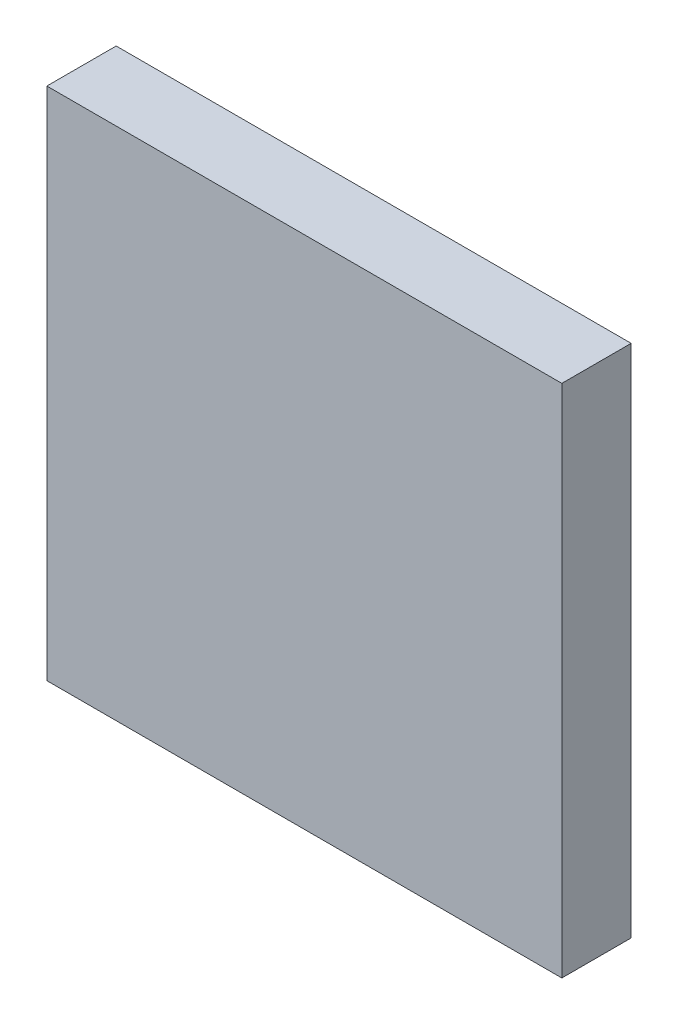
ISO-10303-21;
HEADER;
FILE_DESCRIPTION(('STEP AP214'),'2;1');
FILE_NAME('part.step','',(''),(''),'','','');
FILE_SCHEMA(('AUTOMOTIVE_DESIGN { 1 0 10303 214 1 1 1 1 }'));
ENDSEC;
DATA;
#1=APPLICATION_CONTEXT('core data for automotive mechanical design processes');
#2=APPLICATION_PROTOCOL_DEFINITION('international standard','automotive_design',2000,#1);
#3=PRODUCT_CONTEXT('',#1,'mechanical');
#4=PRODUCT('Part','Part','',(#3));
#5=PRODUCT_RELATED_PRODUCT_CATEGORY('part','',(#4));
#6=PRODUCT_DEFINITION_FORMATION('','',#4);
#7=PRODUCT_DEFINITION_CONTEXT('part definition',#1,'design');
#8=PRODUCT_DEFINITION('design','',#6,#7);
#9=PRODUCT_DEFINITION_SHAPE('','',#8);
#10=(LENGTH_UNIT() NAMED_UNIT(*) SI_UNIT(.MILLI.,.METRE.));
#11=(NAMED_UNIT(*) PLANE_ANGLE_UNIT() SI_UNIT($,.RADIAN.));
#12=(NAMED_UNIT(*) SI_UNIT($,.STERADIAN.) SOLID_ANGLE_UNIT());
#13=UNCERTAINTY_MEASURE_WITH_UNIT(LENGTH_MEASURE(1.E-05),#10,'distance_accuracy_value','');
#14=(GEOMETRIC_REPRESENTATION_CONTEXT(3) GLOBAL_UNCERTAINTY_ASSIGNED_CONTEXT((#13)) GLOBAL_UNIT_ASSIGNED_CONTEXT((#10,
#11,#12)) REPRESENTATION_CONTEXT('',''));
#15=CARTESIAN_POINT('',(0.,0.,0.));
#16=DIRECTION('',(0.,0.,1.));
#17=DIRECTION('',(1.,0.,0.));
#18=AXIS2_PLACEMENT_3D('',#15,#16,#17);
#19=CARTESIAN_POINT('',(11.199999172701,-15.70000094729,0.3499993));
#20=DIRECTION('',(0.,0.,1.));
#21=DIRECTION('',(1.,0.,0.));
#22=AXIS2_PLACEMENT_3D('',#19,#20,#21);
#23=PLANE('',#22);
#24=DIRECTION('',(-1.74845553146897E-07,0.999999999999985,0.));
#25=VECTOR('',#24,1.);
#26=CARTESIAN_POINT('',(13.799999052701,-15.7000004927,0.3499993));
#27=LINE('',#26,#25);
#28=CARTESIAN_POINT('',(13.79999928,-15.7000004926979,0.3499993));
#29=VERTEX_POINT('',#28);
#30=CARTESIAN_POINT('',(13.7999995072991,-18.300000599995,0.3499993));
#31=VERTEX_POINT('',#30);
#32=EDGE_CURVE('E53',#29,#31,#27,.F.);
#33=ORIENTED_EDGE('',*,*,#32,.F.);
#34=DIRECTION('',(-0.999999999999985,-1.74845553146897E-07,0.));
#35=VECTOR('',#34,1.);
#36=CARTESIAN_POINT('',(11.199999172701,-15.70000094729,0.3499993));
#37=LINE('',#36,#35);
#38=CARTESIAN_POINT('',(11.1999991727008,-15.7000008336425,0.3499993));
#39=VERTEX_POINT('',#38);
#40=EDGE_CURVE('E68',#39,#29,#37,.F.);
#41=ORIENTED_EDGE('',*,*,#40,.F.);
#42=DIRECTION('',(1.74845553146897E-07,-0.999999999999985,0.));
#43=VECTOR('',#42,1.);
#44=CARTESIAN_POINT('',(11.199999627299,-18.30000082729,0.3499993));
#45=LINE('',#44,#43);
#46=CARTESIAN_POINT('',(11.1999994,-18.3000008272921,0.3499993));
#47=VERTEX_POINT('',#46);
#48=EDGE_CURVE('E20',#47,#39,#45,.F.);
#49=ORIENTED_EDGE('',*,*,#48,.F.);
#50=DIRECTION('',(0.999999999999985,1.74845553146897E-07,0.));
#51=VECTOR('',#50,1.);
#52=CARTESIAN_POINT('',(13.799999507299,-18.3000003727,0.3499993));
#53=LINE('',#52,#51);
#54=EDGE_CURVE('E58',#31,#47,#53,.F.);
#55=ORIENTED_EDGE('',*,*,#54,.F.);
#56=EDGE_LOOP('',(#33,#41,#49,#55));
#57=FACE_BOUND('',#56,.T.);
#58=ADVANCED_FACE('F17',(#57),#23,.T.);
#59=CARTESIAN_POINT('',(11.199999627299,-18.30000082729,0.));
#60=DIRECTION('',(-0.999999999999985,-1.74845553146897E-07,0.));
#61=DIRECTION('',(1.74845553146897E-07,-0.999999999999985,0.));
#62=AXIS2_PLACEMENT_3D('',#59,#60,#61);
#63=PLANE('',#62);
#64=DIRECTION('',(0.,0.,1.));
#65=VECTOR('',#64,1.);
#66=CARTESIAN_POINT('',(11.199999172701,-15.70000094729,0.));
#67=LINE('',#66,#65);
#68=CARTESIAN_POINT('',(11.1999991727008,-15.7000008336425,0.));
#69=VERTEX_POINT('',#68);
#70=EDGE_CURVE('E79',#69,#39,#67,.T.);
#71=ORIENTED_EDGE('',*,*,#70,.F.);
#72=DIRECTION('',(0.,1.,0.));
#73=VECTOR('',#72,1.);
#74=CARTESIAN_POINT('',(11.199999172701,-15.70000094729,0.));
#75=LINE('',#74,#73);
#76=CARTESIAN_POINT('',(11.1999995136495,-18.3000008272921,0.));
#77=VERTEX_POINT('',#76);
#78=EDGE_CURVE('E74',#69,#77,#75,.F.);
#79=ORIENTED_EDGE('',*,*,#78,.T.);
#80=DIRECTION('',(0.,0.,1.));
#81=VECTOR('',#80,1.);
#82=CARTESIAN_POINT('',(11.199999627299,-18.3000008272984,0.));
#83=LINE('',#82,#81);
#84=EDGE_CURVE('E63',#47,#77,#83,.F.);
#85=ORIENTED_EDGE('',*,*,#84,.F.);
#86=ORIENTED_EDGE('',*,*,#48,.T.);
#87=EDGE_LOOP('',(#71,#79,#85,#86));
#88=FACE_BOUND('',#87,.T.);
#89=ADVANCED_FACE('F73',(#88),#63,.T.);
#90=CARTESIAN_POINT('',(13.799999507299,-18.3000003727,0.));
#91=DIRECTION('',(1.74845553146897E-07,-0.999999999999985,0.));
#92=DIRECTION('',(0.999999999999985,1.74845553146897E-07,0.));
#93=AXIS2_PLACEMENT_3D('',#90,#91,#92);
#94=PLANE('',#93);
#95=ORIENTED_EDGE('',*,*,#84,.T.);
#96=DIRECTION('',(1.,0.,0.));
#97=VECTOR('',#96,1.);
#98=CARTESIAN_POINT('',(11.199999172701,-18.30000082729,0.));
#99=LINE('',#98,#97);
#100=CARTESIAN_POINT('',(13.7999995072991,-18.3000004863475,0.));
#101=VERTEX_POINT('',#100);
#102=EDGE_CURVE('E84',#77,#101,#99,.T.);
#103=ORIENTED_EDGE('',*,*,#102,.T.);
#104=DIRECTION('',(0.,0.,1.));
#105=VECTOR('',#104,1.);
#106=CARTESIAN_POINT('',(13.7999995072994,-18.3000003727,0.));
#107=LINE('',#106,#105);
#108=EDGE_CURVE('E65',#31,#101,#107,.F.);
#109=ORIENTED_EDGE('',*,*,#108,.F.);
#110=ORIENTED_EDGE('',*,*,#54,.T.);
#111=EDGE_LOOP('',(#95,#103,#109,#110));
#112=FACE_BOUND('',#111,.T.);
#113=ADVANCED_FACE('F60',(#112),#94,.T.);
#114=CARTESIAN_POINT('',(13.799999052701,-15.7000004927,0.));
#115=DIRECTION('',(0.999999999999985,1.74845553146897E-07,0.));
#116=DIRECTION('',(-1.74845553146897E-07,0.999999999999985,0.));
#117=AXIS2_PLACEMENT_3D('',#114,#115,#116);
#118=PLANE('',#117);
#119=ORIENTED_EDGE('',*,*,#108,.T.);
#120=DIRECTION('',(0.,1.,0.));
#121=VECTOR('',#120,1.);
#122=CARTESIAN_POINT('',(13.799999507299,-15.70000094729,0.));
#123=LINE('',#122,#121);
#124=CARTESIAN_POINT('',(13.7999991663505,-15.7000004926979,0.));
#125=VERTEX_POINT('',#124);
#126=EDGE_CURVE('E26',#101,#125,#123,.T.);
#127=ORIENTED_EDGE('',*,*,#126,.T.);
#128=DIRECTION('',(0.,0.,1.));
#129=VECTOR('',#128,1.);
#130=CARTESIAN_POINT('',(13.799999052701,-15.7000004926916,0.));
#131=LINE('',#130,#129);
#132=EDGE_CURVE('E34',#29,#125,#131,.F.);
#133=ORIENTED_EDGE('',*,*,#132,.F.);
#134=ORIENTED_EDGE('',*,*,#32,.T.);
#135=EDGE_LOOP('',(#119,#127,#133,#134));
#136=FACE_BOUND('',#135,.T.);
#137=ADVANCED_FACE('F88',(#136),#118,.T.);
#138=CARTESIAN_POINT('',(11.199999172701,-15.70000094729,0.));
#139=DIRECTION('',(-1.74845553146897E-07,0.999999999999985,0.));
#140=DIRECTION('',(-0.999999999999985,-1.74845553146897E-07,0.));
#141=AXIS2_PLACEMENT_3D('',#138,#139,#140);
#142=PLANE('',#141);
#143=ORIENTED_EDGE('',*,*,#132,.T.);
#144=DIRECTION('',(1.,0.,0.));
#145=VECTOR('',#144,1.);
#146=CARTESIAN_POINT('',(11.199999172701,-15.7000004927,0.));
#147=LINE('',#146,#145);
#148=EDGE_CURVE('E11',#125,#69,#147,.F.);
#149=ORIENTED_EDGE('',*,*,#148,.T.);
#150=ORIENTED_EDGE('',*,*,#70,.T.);
#151=ORIENTED_EDGE('',*,*,#40,.T.);
#152=EDGE_LOOP('',(#143,#149,#150,#151));
#153=FACE_BOUND('',#152,.T.);
#154=ADVANCED_FACE('F91',(#153),#142,.T.);
#155=CARTESIAN_POINT('',(11.199999172701,-15.70000094729,0.));
#156=DIRECTION('',(0.,0.,1.));
#157=DIRECTION('',(1.,0.,0.));
#158=AXIS2_PLACEMENT_3D('',#155,#156,#157);
#159=PLANE('',#158);
#160=ORIENTED_EDGE('',*,*,#126,.F.);
#161=ORIENTED_EDGE('',*,*,#102,.F.);
#162=ORIENTED_EDGE('',*,*,#78,.F.);
#163=ORIENTED_EDGE('',*,*,#148,.F.);
#164=EDGE_LOOP('',(#160,#161,#162,#163));
#165=FACE_BOUND('',#164,.T.);
#166=ADVANCED_FACE('F90',(#165),#159,.F.);
#167=CLOSED_SHELL('',(#58,#89,#113,#137,#154,#166));
#168=MANIFOLD_SOLID_BREP('B1',#167);
#169=ADVANCED_BREP_SHAPE_REPRESENTATION('',(#18,#168),#14);
#170=SHAPE_DEFINITION_REPRESENTATION(#9,#169);
ENDSEC;
END-ISO-10303-21;
